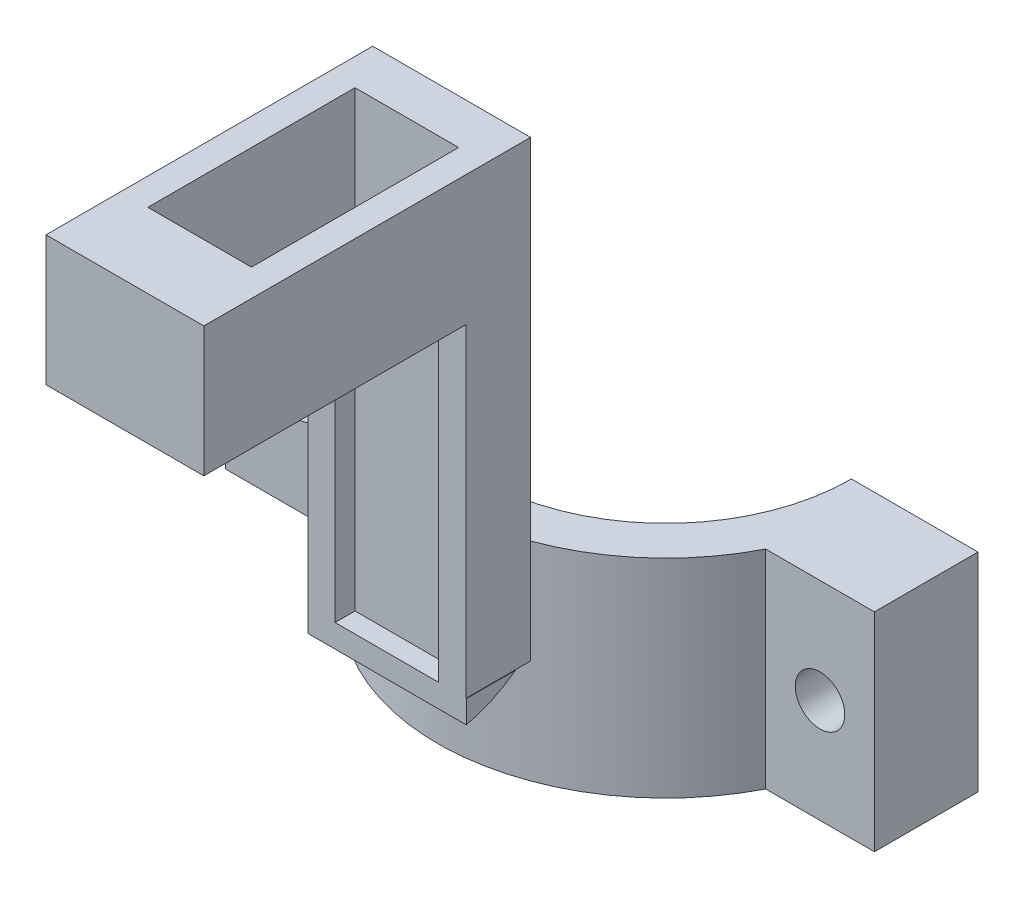
ISO-10303-21;
HEADER;
FILE_DESCRIPTION(('STEP AP214'),'2;1');
FILE_NAME('part.step','',(''),(''),'','','');
FILE_SCHEMA(('AUTOMOTIVE_DESIGN { 1 0 10303 214 1 1 1 1 }'));
ENDSEC;
DATA;
#1=APPLICATION_CONTEXT('core data for automotive mechanical design processes');
#2=APPLICATION_PROTOCOL_DEFINITION('international standard','automotive_design',2000,#1);
#3=PRODUCT_CONTEXT('',#1,'mechanical');
#4=PRODUCT('Part','Part','',(#3));
#5=PRODUCT_RELATED_PRODUCT_CATEGORY('part','',(#4));
#6=PRODUCT_DEFINITION_FORMATION('','',#4);
#7=PRODUCT_DEFINITION_CONTEXT('part definition',#1,'design');
#8=PRODUCT_DEFINITION('design','',#6,#7);
#9=PRODUCT_DEFINITION_SHAPE('','',#8);
#10=(LENGTH_UNIT() NAMED_UNIT(*) SI_UNIT(.MILLI.,.METRE.));
#11=(NAMED_UNIT(*) PLANE_ANGLE_UNIT() SI_UNIT($,.RADIAN.));
#12=(NAMED_UNIT(*) SI_UNIT($,.STERADIAN.) SOLID_ANGLE_UNIT());
#13=UNCERTAINTY_MEASURE_WITH_UNIT(LENGTH_MEASURE(1.E-05),#10,'distance_accuracy_value','');
#14=(GEOMETRIC_REPRESENTATION_CONTEXT(3) GLOBAL_UNCERTAINTY_ASSIGNED_CONTEXT((#13)) GLOBAL_UNIT_ASSIGNED_CONTEXT((#10,
#11,#12)) REPRESENTATION_CONTEXT('',''));
#15=CARTESIAN_POINT('',(0.,0.,0.));
#16=DIRECTION('',(0.,0.,1.));
#17=DIRECTION('',(1.,0.,0.));
#18=AXIS2_PLACEMENT_3D('',#15,#16,#17);
#19=CARTESIAN_POINT('',(-4.,61.28,36.0000000000001));
#20=DIRECTION('',(0.,0.,-1.));
#21=DIRECTION('',(-1.,0.,0.));
#22=AXIS2_PLACEMENT_3D('',#19,#20,#21);
#23=PLANE('',#22);
#24=DIRECTION('',(0.,-1.,0.));
#25=VECTOR('',#24,1.);
#26=CARTESIAN_POINT('',(4.,61.28,36.0000000000001));
#27=LINE('',#26,#25);
#28=CARTESIAN_POINT('',(4.,43.05,36.0000000000001));
#29=VERTEX_POINT('',#28);
#30=CARTESIAN_POINT('',(4.,35.05,36.0000000000001));
#31=VERTEX_POINT('',#30);
#32=EDGE_CURVE('E225',#29,#31,#27,.T.);
#33=ORIENTED_EDGE('',*,*,#32,.T.);
#34=DIRECTION('',(1.,0.,0.));
#35=VECTOR('',#34,1.);
#36=CARTESIAN_POINT('',(4.,35.05,36.0000000000001));
#37=LINE('',#36,#35);
#38=CARTESIAN_POINT('',(-4.,35.05,36.0000000000001));
#39=VERTEX_POINT('',#38);
#40=EDGE_CURVE('E211',#39,#31,#37,.T.);
#41=ORIENTED_EDGE('',*,*,#40,.F.);
#42=DIRECTION('',(0.,-1.,0.));
#43=VECTOR('',#42,1.);
#44=CARTESIAN_POINT('',(-4.,61.28,36.0000000000001));
#45=LINE('',#44,#43);
#46=CARTESIAN_POINT('',(-4.,43.05,36.0000000000001));
#47=VERTEX_POINT('',#46);
#48=EDGE_CURVE('E222',#47,#39,#45,.T.);
#49=ORIENTED_EDGE('',*,*,#48,.F.);
#50=DIRECTION('',(-1.,0.,0.));
#51=VECTOR('',#50,1.);
#52=CARTESIAN_POINT('',(0.,43.05,36.0000000000001));
#53=LINE('',#52,#51);
#54=EDGE_CURVE('E244',#29,#47,#53,.T.);
#55=ORIENTED_EDGE('',*,*,#54,.F.);
#56=EDGE_LOOP('',(#33,#41,#49,#55));
#57=FACE_BOUND('',#56,.T.);
#58=ADVANCED_FACE('F40',(#57),#23,.T.);
#59=CARTESIAN_POINT('',(4.,61.28,20.0000000000001));
#60=DIRECTION('',(-1.,0.,0.));
#61=DIRECTION('',(0.,0.,1.));
#62=AXIS2_PLACEMENT_3D('',#59,#60,#61);
#63=PLANE('',#62);
#64=DIRECTION('',(0.,1.,0.));
#65=VECTOR('',#64,1.);
#66=CARTESIAN_POINT('',(4.,43.05,21.5429101127945));
#67=LINE('',#66,#65);
#68=CARTESIAN_POINT('',(4.,8.05,21.5429101127945));
#69=VERTEX_POINT('',#68);
#70=CARTESIAN_POINT('',(4.,33.02,21.5429101127945));
#71=VERTEX_POINT('',#70);
#72=EDGE_CURVE('E249',#69,#71,#67,.T.);
#73=ORIENTED_EDGE('',*,*,#72,.T.);
#74=DIRECTION('',(0.,0.,1.));
#75=VECTOR('',#74,1.);
#76=CARTESIAN_POINT('',(4.,33.02,19.7700000000001));
#77=LINE('',#76,#75);
#78=CARTESIAN_POINT('',(4.,33.02,20.0000000000001));
#79=VERTEX_POINT('',#78);
#80=EDGE_CURVE('E55',#79,#71,#77,.T.);
#81=ORIENTED_EDGE('',*,*,#80,.F.);
#82=DIRECTION('',(0.,-1.,0.));
#83=VECTOR('',#82,1.);
#84=CARTESIAN_POINT('',(4.,61.28,20.0000000000001));
#85=LINE('',#84,#83);
#86=CARTESIAN_POINT('',(4.,8.05,20.0000000000001));
#87=VERTEX_POINT('',#86);
#88=EDGE_CURVE('E240',#79,#87,#85,.T.);
#89=ORIENTED_EDGE('',*,*,#88,.T.);
#90=DIRECTION('',(0.,0.,-1.));
#91=VECTOR('',#90,1.);
#92=CARTESIAN_POINT('',(4.,8.05,20.0000000000001));
#93=LINE('',#92,#91);
#94=EDGE_CURVE('E412',#69,#87,#93,.T.);
#95=ORIENTED_EDGE('',*,*,#94,.F.);
#96=EDGE_LOOP('',(#73,#81,#89,#95));
#97=FACE_BOUND('',#96,.T.);
#98=ADVANCED_FACE('F448',(#97),#63,.T.);
#99=CARTESIAN_POINT('',(4.,43.05,20.0000000000001));
#100=VERTEX_POINT('',#99);
#101=CARTESIAN_POINT('',(4.,35.05,20.0000000000001));
#102=VERTEX_POINT('',#101);
#103=EDGE_CURVE('E241',#100,#102,#85,.T.);
#104=ORIENTED_EDGE('',*,*,#103,.T.);
#105=DIRECTION('',(0.,0.,1.));
#106=VECTOR('',#105,1.);
#107=CARTESIAN_POINT('',(4.,35.05,19.7700000000001));
#108=LINE('',#107,#106);
#109=EDGE_CURVE('E226',#102,#31,#108,.T.);
#110=ORIENTED_EDGE('',*,*,#109,.T.);
#111=ORIENTED_EDGE('',*,*,#32,.F.);
#112=DIRECTION('',(0.,0.,1.));
#113=VECTOR('',#112,1.);
#114=CARTESIAN_POINT('',(4.,43.05,0.));
#115=LINE('',#114,#113);
#116=EDGE_CURVE('E251',#100,#29,#115,.T.);
#117=ORIENTED_EDGE('',*,*,#116,.F.);
#118=EDGE_LOOP('',(#104,#110,#111,#117));
#119=FACE_BOUND('',#118,.T.);
#120=ADVANCED_FACE('F428',(#119),#63,.T.);
#121=CARTESIAN_POINT('',(-4.,61.28,20.0000000000001));
#122=DIRECTION('',(0.,0.,1.));
#123=DIRECTION('',(1.,0.,0.));
#124=AXIS2_PLACEMENT_3D('',#121,#122,#123);
#125=PLANE('',#124);
#126=ORIENTED_EDGE('',*,*,#88,.F.);
#127=DIRECTION('',(-1.,0.,0.));
#128=VECTOR('',#127,1.);
#129=CARTESIAN_POINT('',(-4.,33.02,20.0000000000001));
#130=LINE('',#129,#128);
#131=CARTESIAN_POINT('',(-4.,33.02,20.0000000000001));
#132=VERTEX_POINT('',#131);
#133=EDGE_CURVE('E62',#79,#132,#130,.T.);
#134=ORIENTED_EDGE('',*,*,#133,.T.);
#135=DIRECTION('',(0.,-1.,0.));
#136=VECTOR('',#135,1.);
#137=CARTESIAN_POINT('',(-4.,61.28,20.0000000000001));
#138=LINE('',#137,#136);
#139=CARTESIAN_POINT('',(-4.,8.05,20.0000000000001));
#140=VERTEX_POINT('',#139);
#141=EDGE_CURVE('E232',#132,#140,#138,.T.);
#142=ORIENTED_EDGE('',*,*,#141,.T.);
#143=DIRECTION('',(-1.,0.,0.));
#144=VECTOR('',#143,1.);
#145=CARTESIAN_POINT('',(-4.,8.05,20.0000000000001));
#146=LINE('',#145,#144);
#147=EDGE_CURVE('E410',#87,#140,#146,.T.);
#148=ORIENTED_EDGE('',*,*,#147,.F.);
#149=EDGE_LOOP('',(#126,#134,#142,#148));
#150=FACE_BOUND('',#149,.T.);
#151=ADVANCED_FACE('F460',(#150),#125,.T.);
#152=CARTESIAN_POINT('',(-4.,43.05,20.0000000000001));
#153=VERTEX_POINT('',#152);
#154=CARTESIAN_POINT('',(-4.,35.05,20.0000000000001));
#155=VERTEX_POINT('',#154);
#156=EDGE_CURVE('E234',#153,#155,#138,.T.);
#157=ORIENTED_EDGE('',*,*,#156,.T.);
#158=DIRECTION('',(1.,0.,0.));
#159=VECTOR('',#158,1.);
#160=CARTESIAN_POINT('',(-4.,35.05,20.0000000000001));
#161=LINE('',#160,#159);
#162=EDGE_CURVE('E214',#155,#102,#161,.T.);
#163=ORIENTED_EDGE('',*,*,#162,.T.);
#164=ORIENTED_EDGE('',*,*,#103,.F.);
#165=DIRECTION('',(1.,0.,0.));
#166=VECTOR('',#165,1.);
#167=CARTESIAN_POINT('',(0.,43.05,20.0000000000001));
#168=LINE('',#167,#166);
#169=EDGE_CURVE('E392',#153,#100,#168,.T.);
#170=ORIENTED_EDGE('',*,*,#169,.F.);
#171=EDGE_LOOP('',(#157,#163,#164,#170));
#172=FACE_BOUND('',#171,.T.);
#173=ADVANCED_FACE('F431',(#172),#125,.T.);
#174=CARTESIAN_POINT('',(-4.,61.28,20.0000000000001));
#175=DIRECTION('',(1.,0.,0.));
#176=DIRECTION('',(0.,0.,-1.));
#177=AXIS2_PLACEMENT_3D('',#174,#175,#176);
#178=PLANE('',#177);
#179=ORIENTED_EDGE('',*,*,#141,.F.);
#180=DIRECTION('',(0.,0.,1.));
#181=VECTOR('',#180,1.);
#182=CARTESIAN_POINT('',(-4.,33.02,20.0000000000001));
#183=LINE('',#182,#181);
#184=CARTESIAN_POINT('',(-4.,33.02,21.5429101127945));
#185=VERTEX_POINT('',#184);
#186=EDGE_CURVE('E12',#132,#185,#183,.T.);
#187=ORIENTED_EDGE('',*,*,#186,.T.);
#188=DIRECTION('',(0.,-1.,0.));
#189=VECTOR('',#188,1.);
#190=CARTESIAN_POINT('',(-4.,43.05,21.5429101127945));
#191=LINE('',#190,#189);
#192=CARTESIAN_POINT('',(-4.,8.05,21.5429101127945));
#193=VERTEX_POINT('',#192);
#194=EDGE_CURVE('E246',#185,#193,#191,.T.);
#195=ORIENTED_EDGE('',*,*,#194,.T.);
#196=DIRECTION('',(0.,0.,1.));
#197=VECTOR('',#196,1.);
#198=CARTESIAN_POINT('',(-4.,8.05,20.0000000000001));
#199=LINE('',#198,#197);
#200=EDGE_CURVE('E236',#140,#193,#199,.T.);
#201=ORIENTED_EDGE('',*,*,#200,.F.);
#202=EDGE_LOOP('',(#179,#187,#195,#201));
#203=FACE_BOUND('',#202,.T.);
#204=ADVANCED_FACE('F457',(#203),#178,.T.);
#205=ORIENTED_EDGE('',*,*,#48,.T.);
#206=DIRECTION('',(0.,0.,-1.));
#207=VECTOR('',#206,1.);
#208=CARTESIAN_POINT('',(-4.,35.05,20.0000000000001));
#209=LINE('',#208,#207);
#210=EDGE_CURVE('E48',#39,#155,#209,.T.);
#211=ORIENTED_EDGE('',*,*,#210,.T.);
#212=ORIENTED_EDGE('',*,*,#156,.F.);
#213=DIRECTION('',(0.,0.,-1.));
#214=VECTOR('',#213,1.);
#215=CARTESIAN_POINT('',(-4.00000000000001,43.05,0.));
#216=LINE('',#215,#214);
#217=EDGE_CURVE('E230',#47,#153,#216,.T.);
#218=ORIENTED_EDGE('',*,*,#217,.F.);
#219=EDGE_LOOP('',(#205,#211,#212,#218));
#220=FACE_BOUND('',#219,.T.);
#221=ADVANCED_FACE('F228',(#220),#178,.T.);
#222=CARTESIAN_POINT('',(-6.095,43.05,21.5429101127945));
#223=DIRECTION('',(0.,0.,-1.));
#224=DIRECTION('',(-1.,0.,0.));
#225=AXIS2_PLACEMENT_3D('',#222,#223,#224);
#226=PLANE('',#225);
#227=ORIENTED_EDGE('',*,*,#194,.F.);
#228=DIRECTION('',(1.,0.,0.));
#229=VECTOR('',#228,1.);
#230=CARTESIAN_POINT('',(-6.095,33.02,21.5429101127945));
#231=LINE('',#230,#229);
#232=CARTESIAN_POINT('',(-6.095,33.02,21.5429101127945));
#233=VERTEX_POINT('',#232);
#234=EDGE_CURVE('E259',#233,#185,#231,.T.);
#235=ORIENTED_EDGE('',*,*,#234,.F.);
#236=DIRECTION('',(0.,-1.,0.));
#237=VECTOR('',#236,1.);
#238=CARTESIAN_POINT('',(-6.095,43.05,21.5429101127945));
#239=LINE('',#238,#237);
#240=CARTESIAN_POINT('',(-6.095,6.27160293898606,21.5429101127945));
#241=VERTEX_POINT('',#240);
#242=EDGE_CURVE('E290',#233,#241,#239,.T.);
#243=ORIENTED_EDGE('',*,*,#242,.T.);
#244=DIRECTION('',(1.,0.,0.));
#245=VECTOR('',#244,1.);
#246=CARTESIAN_POINT('',(-6.095,6.27160293898606,21.5429101127945));
#247=LINE('',#246,#245);
#248=CARTESIAN_POINT('',(6.13145783911052,6.27160293898606,21.5429101127945));
#249=VERTEX_POINT('',#248);
#250=EDGE_CURVE('E422',#241,#249,#247,.T.);
#251=ORIENTED_EDGE('',*,*,#250,.T.);
#252=DIRECTION('',(0.,-1.,0.));
#253=VECTOR('',#252,1.);
#254=CARTESIAN_POINT('',(6.13145783911052,6.025,21.5429101127945));
#255=LINE('',#254,#253);
#256=CARTESIAN_POINT('',(6.13145783911052,8.025,21.5429101127945));
#257=VERTEX_POINT('',#256);
#258=EDGE_CURVE('E419',#257,#249,#255,.T.);
#259=ORIENTED_EDGE('',*,*,#258,.F.);
#260=DIRECTION('',(1.,0.,0.));
#261=VECTOR('',#260,1.);
#262=CARTESIAN_POINT('',(0.,8.025,21.5429101127945));
#263=LINE('',#262,#261);
#264=CARTESIAN_POINT('',(6.095,8.025,21.5429101127945));
#265=VERTEX_POINT('',#264);
#266=EDGE_CURVE('E416',#265,#257,#263,.T.);
#267=ORIENTED_EDGE('',*,*,#266,.F.);
#268=DIRECTION('',(0.,-1.,0.));
#269=VECTOR('',#268,1.);
#270=CARTESIAN_POINT('',(6.095,43.05,21.5429101127945));
#271=LINE('',#270,#269);
#272=CARTESIAN_POINT('',(6.095,33.02,21.5429101127945));
#273=VERTEX_POINT('',#272);
#274=EDGE_CURVE('E288',#273,#265,#271,.T.);
#275=ORIENTED_EDGE('',*,*,#274,.F.);
#276=EDGE_CURVE('E254',#71,#273,#231,.T.);
#277=ORIENTED_EDGE('',*,*,#276,.F.);
#278=ORIENTED_EDGE('',*,*,#72,.F.);
#279=DIRECTION('',(-1.,0.,0.));
#280=VECTOR('',#279,1.);
#281=CARTESIAN_POINT('',(0.,8.05,21.5429101127945));
#282=LINE('',#281,#280);
#283=EDGE_CURVE('E219',#69,#193,#282,.T.);
#284=ORIENTED_EDGE('',*,*,#283,.T.);
#285=EDGE_LOOP('',(#227,#235,#243,#251,#259,#267,#275,#277,#278,#284));
#286=FACE_BOUND('',#285,.T.);
#287=ADVANCED_FACE('F400',(#286),#226,.F.);
#288=CARTESIAN_POINT('',(0.,43.05,0.));
#289=DIRECTION('',(0.,1.,0.));
#290=DIRECTION('',(0.,0.,1.));
#291=AXIS2_PLACEMENT_3D('',#288,#289,#290);
#292=PLANE('',#291);
#293=DIRECTION('',(0.,0.,1.));
#294=VECTOR('',#293,1.);
#295=CARTESIAN_POINT('',(-6.095,43.05,16.5429101127945));
#296=LINE('',#295,#294);
#297=CARTESIAN_POINT('',(-6.095,43.05,16.5429101127945));
#298=VERTEX_POINT('',#297);
#299=CARTESIAN_POINT('',(-6.095,43.05,41.7729101127945));
#300=VERTEX_POINT('',#299);
#301=EDGE_CURVE('E274',#298,#300,#296,.T.);
#302=ORIENTED_EDGE('',*,*,#301,.T.);
#303=DIRECTION('',(-1.,0.,0.));
#304=VECTOR('',#303,1.);
#305=CARTESIAN_POINT('',(-6.095,43.05,41.7729101127945));
#306=LINE('',#305,#304);
#307=CARTESIAN_POINT('',(6.095,43.05,41.7729101127945));
#308=VERTEX_POINT('',#307);
#309=EDGE_CURVE('E264',#308,#300,#306,.T.);
#310=ORIENTED_EDGE('',*,*,#309,.F.);
#311=DIRECTION('',(0.,0.,-1.));
#312=VECTOR('',#311,1.);
#313=CARTESIAN_POINT('',(6.095,43.05,16.5429101127945));
#314=LINE('',#313,#312);
#315=CARTESIAN_POINT('',(6.095,43.05,16.5429101127945));
#316=VERTEX_POINT('',#315);
#317=EDGE_CURVE('E276',#308,#316,#314,.T.);
#318=ORIENTED_EDGE('',*,*,#317,.T.);
#319=DIRECTION('',(-1.,0.,0.));
#320=VECTOR('',#319,1.);
#321=CARTESIAN_POINT('',(-6.095,43.05,16.5429101127945));
#322=LINE('',#321,#320);
#323=EDGE_CURVE('E278',#316,#298,#322,.T.);
#324=ORIENTED_EDGE('',*,*,#323,.T.);
#325=EDGE_LOOP('',(#302,#310,#318,#324));
#326=FACE_BOUND('',#325,.T.);
#327=ORIENTED_EDGE('',*,*,#169,.T.);
#328=ORIENTED_EDGE('',*,*,#116,.T.);
#329=ORIENTED_EDGE('',*,*,#54,.T.);
#330=ORIENTED_EDGE('',*,*,#217,.T.);
#331=EDGE_LOOP('',(#327,#328,#329,#330));
#332=FACE_BOUND('',#331,.T.);
#333=ADVANCED_FACE('F433',(#326,#332),#292,.T.);
#334=CARTESIAN_POINT('',(-6.095,33.02,41.7729101127945));
#335=DIRECTION('',(0.,1.,0.));
#336=DIRECTION('',(0.,0.,1.));
#337=AXIS2_PLACEMENT_3D('',#334,#335,#336);
#338=PLANE('',#337);
#339=ORIENTED_EDGE('',*,*,#80,.T.);
#340=ORIENTED_EDGE('',*,*,#276,.T.);
#341=DIRECTION('',(0.,0.,-1.));
#342=VECTOR('',#341,1.);
#343=CARTESIAN_POINT('',(6.095,33.02,41.7729101127945));
#344=LINE('',#343,#342);
#345=CARTESIAN_POINT('',(6.095,33.02,41.7729101127945));
#346=VERTEX_POINT('',#345);
#347=EDGE_CURVE('E267',#346,#273,#344,.T.);
#348=ORIENTED_EDGE('',*,*,#347,.F.);
#349=DIRECTION('',(1.,0.,0.));
#350=VECTOR('',#349,1.);
#351=CARTESIAN_POINT('',(-6.095,33.02,41.7729101127945));
#352=LINE('',#351,#350);
#353=CARTESIAN_POINT('',(-6.095,33.02,41.7729101127945));
#354=VERTEX_POINT('',#353);
#355=EDGE_CURVE('E258',#354,#346,#352,.T.);
#356=ORIENTED_EDGE('',*,*,#355,.F.);
#357=DIRECTION('',(0.,0.,-1.));
#358=VECTOR('',#357,1.);
#359=CARTESIAN_POINT('',(-6.095,33.02,41.7729101127945));
#360=LINE('',#359,#358);
#361=EDGE_CURVE('E271',#354,#233,#360,.T.);
#362=ORIENTED_EDGE('',*,*,#361,.T.);
#363=ORIENTED_EDGE('',*,*,#234,.T.);
#364=ORIENTED_EDGE('',*,*,#186,.F.);
#365=ORIENTED_EDGE('',*,*,#133,.F.);
#366=EDGE_LOOP('',(#339,#340,#348,#356,#362,#363,#364,#365));
#367=FACE_BOUND('',#366,.T.);
#368=ADVANCED_FACE('F435',(#367),#338,.F.);
#369=CARTESIAN_POINT('',(0.,16.05,0.));
#370=DIRECTION('',(0.,1.,0.));
#371=DIRECTION('',(0.,0.,1.));
#372=AXIS2_PLACEMENT_3D('',#369,#370,#371);
#373=PLANE('',#372);
#374=DIRECTION('',(-1.,0.,0.));
#375=VECTOR('',#374,1.);
#376=CARTESIAN_POINT('',(-6.095,16.05,16.5429101127945));
#377=LINE('',#376,#375);
#378=CARTESIAN_POINT('',(6.095,16.05,16.5429101127945));
#379=VERTEX_POINT('',#378);
#380=CARTESIAN_POINT('',(-6.095,16.05,16.5429101127945));
#381=VERTEX_POINT('',#380);
#382=EDGE_CURVE('E273',#379,#381,#377,.T.);
#383=ORIENTED_EDGE('',*,*,#382,.F.);
#384=CARTESIAN_POINT('',(0.,16.05,0.));
#385=DIRECTION('',(0.,1.,0.));
#386=DIRECTION('',(1.,0.,0.));
#387=AXIS2_PLACEMENT_3D('',#384,#385,#386);
#388=CIRCLE('',#387,17.63);
#389=CARTESIAN_POINT('',(15.7104073785501,16.05,8.));
#390=VERTEX_POINT('',#389);
#391=EDGE_CURVE('E369',#379,#390,#388,.T.);
#392=ORIENTED_EDGE('',*,*,#391,.T.);
#393=DIRECTION('',(1.,0.,0.));
#394=VECTOR('',#393,1.);
#395=CARTESIAN_POINT('',(14.75,16.05,8.));
#396=LINE('',#395,#394);
#397=CARTESIAN_POINT('',(24.11,16.05,8.));
#398=VERTEX_POINT('',#397);
#399=EDGE_CURVE('E353',#390,#398,#396,.T.);
#400=ORIENTED_EDGE('',*,*,#399,.T.);
#401=DIRECTION('',(0.,0.,1.));
#402=VECTOR('',#401,1.);
#403=CARTESIAN_POINT('',(24.11,16.05,-8.));
#404=LINE('',#403,#402);
#405=CARTESIAN_POINT('',(24.11,16.05,0.));
#406=VERTEX_POINT('',#405);
#407=EDGE_CURVE('E346',#406,#398,#404,.T.);
#408=ORIENTED_EDGE('',*,*,#407,.F.);
#409=DIRECTION('',(1.,0.,0.));
#410=VECTOR('',#409,1.);
#411=CARTESIAN_POINT('',(24.11,16.05,0.));
#412=LINE('',#411,#410);
#413=CARTESIAN_POINT('',(14.34,16.05,0.));
#414=VERTEX_POINT('',#413);
#415=EDGE_CURVE('E301',#414,#406,#412,.T.);
#416=ORIENTED_EDGE('',*,*,#415,.F.);
#417=CARTESIAN_POINT('',(0.,16.05,0.));
#418=DIRECTION('',(0.,1.,0.));
#419=DIRECTION('',(0.,0.,1.));
#420=AXIS2_PLACEMENT_3D('',#417,#418,#419);
#421=CIRCLE('',#420,14.34);
#422=CARTESIAN_POINT('',(-14.34,16.05,0.));
#423=VERTEX_POINT('',#422);
#424=EDGE_CURVE('E360',#423,#414,#421,.T.);
#425=ORIENTED_EDGE('',*,*,#424,.F.);
#426=CARTESIAN_POINT('',(-26.54,16.05,0.));
#427=VERTEX_POINT('',#426);
#428=EDGE_CURVE('E306',#427,#423,#412,.T.);
#429=ORIENTED_EDGE('',*,*,#428,.F.);
#430=DIRECTION('',(0.,0.,-1.));
#431=VECTOR('',#430,1.);
#432=CARTESIAN_POINT('',(-26.54,16.05,-8.54354494360273));
#433=LINE('',#432,#431);
#434=CARTESIAN_POINT('',(-26.54,16.05,7.45645505639727));
#435=VERTEX_POINT('',#434);
#436=EDGE_CURVE('E325',#435,#427,#433,.T.);
#437=ORIENTED_EDGE('',*,*,#436,.F.);
#438=DIRECTION('',(1.,0.,0.));
#439=VECTOR('',#438,1.);
#440=CARTESIAN_POINT('',(-27.75,16.05,7.45645505639727));
#441=LINE('',#440,#439);
#442=CARTESIAN_POINT('',(-15.9755493799721,16.05,7.45645505639727));
#443=VERTEX_POINT('',#442);
#444=EDGE_CURVE('E334',#435,#443,#441,.T.);
#445=ORIENTED_EDGE('',*,*,#444,.T.);
#446=EDGE_CURVE('E366',#443,#381,#388,.T.);
#447=ORIENTED_EDGE('',*,*,#446,.T.);
#448=EDGE_LOOP('',(#383,#392,#400,#408,#416,#425,#429,#437,#445,#447));
#449=FACE_BOUND('',#448,.T.);
#450=ADVANCED_FACE('F442',(#449),#373,.T.);
#451=CARTESIAN_POINT('',(-6.095,8.025,14.98));
#452=DIRECTION('',(0.,-1.,0.));
#453=DIRECTION('',(0.,0.,-1.));
#454=AXIS2_PLACEMENT_3D('',#451,#452,#453);
#455=PLANE('',#454);
#456=DIRECTION('',(0.,0.,1.));
#457=VECTOR('',#456,1.);
#458=CARTESIAN_POINT('',(6.095,8.025,14.98));
#459=LINE('',#458,#457);
#460=CARTESIAN_POINT('',(6.095,8.025,16.5429101127945));
#461=VERTEX_POINT('',#460);
#462=CARTESIAN_POINT('',(6.095,8.025,17.75));
#463=VERTEX_POINT('',#462);
#464=EDGE_CURVE('E338',#461,#463,#459,.T.);
#465=ORIENTED_EDGE('',*,*,#464,.T.);
#466=DIRECTION('',(1.,0.,0.));
#467=VECTOR('',#466,1.);
#468=CARTESIAN_POINT('',(-6.095,8.025,17.75));
#469=LINE('',#468,#467);
#470=CARTESIAN_POINT('',(-6.095,8.025,17.75));
#471=VERTEX_POINT('',#470);
#472=EDGE_CURVE('E293',#471,#463,#469,.T.);
#473=ORIENTED_EDGE('',*,*,#472,.F.);
#474=DIRECTION('',(0.,0.,1.));
#475=VECTOR('',#474,1.);
#476=CARTESIAN_POINT('',(-6.095,8.025,14.98));
#477=LINE('',#476,#475);
#478=CARTESIAN_POINT('',(-6.095,8.025,16.5429101127945));
#479=VERTEX_POINT('',#478);
#480=EDGE_CURVE('E336',#479,#471,#477,.T.);
#481=ORIENTED_EDGE('',*,*,#480,.F.);
#482=CARTESIAN_POINT('',(0.,8.025,0.));
#483=DIRECTION('',(0.,-1.,0.));
#484=DIRECTION('',(0.,0.,-1.));
#485=AXIS2_PLACEMENT_3D('',#482,#483,#484);
#486=CIRCLE('',#485,17.63);
#487=EDGE_CURVE('E376',#461,#479,#486,.T.);
#488=ORIENTED_EDGE('',*,*,#487,.F.);
#489=EDGE_LOOP('',(#465,#473,#481,#488));
#490=FACE_BOUND('',#489,.T.);
#491=ADVANCED_FACE('F488',(#490),#455,.T.);
#492=CARTESIAN_POINT('',(0.,16.05,0.));
#493=DIRECTION('',(0.,-1.,0.));
#494=DIRECTION('',(0.,0.,-1.));
#495=AXIS2_PLACEMENT_3D('',#492,#493,#494);
#496=CYLINDRICAL_SURFACE('',#495,17.63);
#497=ORIENTED_EDGE('',*,*,#446,.F.);
#498=DIRECTION('',(0.,-1.,0.));
#499=VECTOR('',#498,1.);
#500=CARTESIAN_POINT('',(-15.9755493799721,16.05,7.45645505639727));
#501=LINE('',#500,#499);
#502=CARTESIAN_POINT('',(-15.9755493799721,0.,7.45645505639727));
#503=VERTEX_POINT('',#502);
#504=EDGE_CURVE('E382',#443,#503,#501,.T.);
#505=ORIENTED_EDGE('',*,*,#504,.T.);
#506=CARTESIAN_POINT('',(0.,0.,0.));
#507=DIRECTION('',(0.,1.,0.));
#508=DIRECTION('',(1.,0.,0.));
#509=AXIS2_PLACEMENT_3D('',#506,#507,#508);
#510=CIRCLE('',#509,17.63);
#511=CARTESIAN_POINT('',(15.7104073785501,0.,8.));
#512=VERTEX_POINT('',#511);
#513=EDGE_CURVE('E363',#503,#512,#510,.T.);
#514=ORIENTED_EDGE('',*,*,#513,.T.);
#515=DIRECTION('',(0.,-1.,0.));
#516=VECTOR('',#515,1.);
#517=CARTESIAN_POINT('',(15.7104073785501,16.05,8.));
#518=LINE('',#517,#516);
#519=EDGE_CURVE('E368',#512,#390,#518,.F.);
#520=ORIENTED_EDGE('',*,*,#519,.T.);
#521=ORIENTED_EDGE('',*,*,#391,.F.);
#522=DIRECTION('',(0.,-1.,0.));
#523=VECTOR('',#522,1.);
#524=CARTESIAN_POINT('',(6.095,16.05,16.5429101127945));
#525=LINE('',#524,#523);
#526=EDGE_CURVE('E379',#379,#461,#525,.T.);
#527=ORIENTED_EDGE('',*,*,#526,.T.);
#528=ORIENTED_EDGE('',*,*,#487,.T.);
#529=DIRECTION('',(0.,-1.,0.));
#530=VECTOR('',#529,1.);
#531=CARTESIAN_POINT('',(-6.095,16.05,16.5429101127945));
#532=LINE('',#531,#530);
#533=EDGE_CURVE('E373',#479,#381,#532,.F.);
#534=ORIENTED_EDGE('',*,*,#533,.T.);
#535=EDGE_LOOP('',(#497,#505,#514,#520,#521,#527,#528,#534));
#536=FACE_BOUND('',#535,.T.);
#537=ADVANCED_FACE('F492',(#536),#496,.T.);
#538=CARTESIAN_POINT('',(0.,0.,0.));
#539=DIRECTION('',(0.,1.,0.));
#540=DIRECTION('',(0.,0.,1.));
#541=AXIS2_PLACEMENT_3D('',#538,#539,#540);
#542=PLANE('',#541);
#543=DIRECTION('',(0.,0.,-1.));
#544=VECTOR('',#543,1.);
#545=CARTESIAN_POINT('',(-26.54,0.,-8.54354494360273));
#546=LINE('',#545,#544);
#547=CARTESIAN_POINT('',(-26.54,0.,7.45645505639727));
#548=VERTEX_POINT('',#547);
#549=CARTESIAN_POINT('',(-26.54,0.,0.));
#550=VERTEX_POINT('',#549);
#551=EDGE_CURVE('E326',#548,#550,#546,.T.);
#552=ORIENTED_EDGE('',*,*,#551,.T.);
#553=DIRECTION('',(1.,0.,0.));
#554=VECTOR('',#553,1.);
#555=CARTESIAN_POINT('',(24.11,0.,0.));
#556=LINE('',#555,#554);
#557=CARTESIAN_POINT('',(-14.34,0.,0.));
#558=VERTEX_POINT('',#557);
#559=EDGE_CURVE('E305',#550,#558,#556,.T.);
#560=ORIENTED_EDGE('',*,*,#559,.T.);
#561=CARTESIAN_POINT('',(0.,0.,0.));
#562=DIRECTION('',(0.,1.,0.));
#563=DIRECTION('',(0.,0.,1.));
#564=AXIS2_PLACEMENT_3D('',#561,#562,#563);
#565=CIRCLE('',#564,14.34);
#566=CARTESIAN_POINT('',(14.34,0.,0.));
#567=VERTEX_POINT('',#566);
#568=EDGE_CURVE('E357',#558,#567,#565,.T.);
#569=ORIENTED_EDGE('',*,*,#568,.T.);
#570=CARTESIAN_POINT('',(24.11,0.,0.));
#571=VERTEX_POINT('',#570);
#572=EDGE_CURVE('E302',#567,#571,#556,.T.);
#573=ORIENTED_EDGE('',*,*,#572,.T.);
#574=DIRECTION('',(0.,0.,1.));
#575=VECTOR('',#574,1.);
#576=CARTESIAN_POINT('',(24.11,0.,-8.));
#577=LINE('',#576,#575);
#578=CARTESIAN_POINT('',(24.11,0.,8.));
#579=VERTEX_POINT('',#578);
#580=EDGE_CURVE('E347',#571,#579,#577,.T.);
#581=ORIENTED_EDGE('',*,*,#580,.T.);
#582=DIRECTION('',(1.,0.,0.));
#583=VECTOR('',#582,1.);
#584=CARTESIAN_POINT('',(14.75,0.,8.));
#585=LINE('',#584,#583);
#586=EDGE_CURVE('E354',#512,#579,#585,.T.);
#587=ORIENTED_EDGE('',*,*,#586,.F.);
#588=ORIENTED_EDGE('',*,*,#513,.F.);
#589=DIRECTION('',(1.,0.,0.));
#590=VECTOR('',#589,1.);
#591=CARTESIAN_POINT('',(-27.75,0.,7.45645505639727));
#592=LINE('',#591,#590);
#593=EDGE_CURVE('E333',#548,#503,#592,.T.);
#594=ORIENTED_EDGE('',*,*,#593,.F.);
#595=EDGE_LOOP('',(#552,#560,#569,#573,#581,#587,#588,#594));
#596=FACE_BOUND('',#595,.T.);
#597=ADVANCED_FACE('F522',(#596),#542,.F.);
#598=CARTESIAN_POINT('',(0.,16.05,0.));
#599=DIRECTION('',(0.,-1.,0.));
#600=DIRECTION('',(0.,0.,-1.));
#601=AXIS2_PLACEMENT_3D('',#598,#599,#600);
#602=CYLINDRICAL_SURFACE('',#601,14.34);
#603=DIRECTION('',(0.,-1.,0.));
#604=VECTOR('',#603,1.);
#605=CARTESIAN_POINT('',(-14.34,16.05,0.));
#606=LINE('',#605,#604);
#607=EDGE_CURVE('E320',#423,#558,#606,.T.);
#608=ORIENTED_EDGE('',*,*,#607,.F.);
#609=ORIENTED_EDGE('',*,*,#424,.T.);
#610=DIRECTION('',(0.,-1.,0.));
#611=VECTOR('',#610,1.);
#612=CARTESIAN_POINT('',(14.34,16.05,0.));
#613=LINE('',#612,#611);
#614=EDGE_CURVE('E318',#567,#414,#613,.F.);
#615=ORIENTED_EDGE('',*,*,#614,.F.);
#616=ORIENTED_EDGE('',*,*,#568,.F.);
#617=EDGE_LOOP('',(#608,#609,#615,#616));
#618=FACE_BOUND('',#617,.T.);
#619=ADVANCED_FACE('F541',(#618),#602,.F.);
#620=CARTESIAN_POINT('',(14.75,16.05,8.));
#621=DIRECTION('',(0.,0.,1.));
#622=DIRECTION('',(1.,0.,0.));
#623=AXIS2_PLACEMENT_3D('',#620,#621,#622);
#624=PLANE('',#623);
#625=CARTESIAN_POINT('',(19.9102036892766,8.02500000000175,8.));
#626=DIRECTION('',(0.,0.,1.));
#627=DIRECTION('',(1.,0.,0.));
#628=AXIS2_PLACEMENT_3D('',#625,#626,#627);
#629=CIRCLE('',#628,1.91);
#630=CARTESIAN_POINT('',(21.8202036892766,8.02500000000175,8.));
#631=VERTEX_POINT('',#630);
#632=EDGE_CURVE('E341',#631,#631,#629,.T.);
#633=ORIENTED_EDGE('',*,*,#632,.F.);
#634=EDGE_LOOP('',(#633));
#635=FACE_BOUND('',#634,.T.);
#636=DIRECTION('',(0.,1.,0.));
#637=VECTOR('',#636,1.);
#638=CARTESIAN_POINT('',(24.11,0.,8.));
#639=LINE('',#638,#637);
#640=EDGE_CURVE('E349',#579,#398,#639,.T.);
#641=ORIENTED_EDGE('',*,*,#640,.T.);
#642=ORIENTED_EDGE('',*,*,#399,.F.);
#643=ORIENTED_EDGE('',*,*,#519,.F.);
#644=ORIENTED_EDGE('',*,*,#586,.T.);
#645=EDGE_LOOP('',(#641,#642,#643,#644));
#646=FACE_BOUND('',#645,.T.);
#647=ADVANCED_FACE('F525',(#635,#646),#624,.T.);
#648=CARTESIAN_POINT('',(24.11,0.,-8.));
#649=DIRECTION('',(-1.,0.,0.));
#650=DIRECTION('',(0.,0.,1.));
#651=AXIS2_PLACEMENT_3D('',#648,#649,#650);
#652=PLANE('',#651);
#653=ORIENTED_EDGE('',*,*,#580,.F.);
#654=DIRECTION('',(0.,1.,0.));
#655=VECTOR('',#654,1.);
#656=CARTESIAN_POINT('',(24.11,0.,0.));
#657=LINE('',#656,#655);
#658=EDGE_CURVE('E308',#571,#406,#657,.T.);
#659=ORIENTED_EDGE('',*,*,#658,.T.);
#660=ORIENTED_EDGE('',*,*,#407,.T.);
#661=ORIENTED_EDGE('',*,*,#640,.F.);
#662=EDGE_LOOP('',(#653,#659,#660,#661));
#663=FACE_BOUND('',#662,.T.);
#664=ADVANCED_FACE('F532',(#663),#652,.F.);
#665=CARTESIAN_POINT('',(19.9102036892766,8.02500000000175,-17.63));
#666=DIRECTION('',(0.,0.,1.));
#667=DIRECTION('',(1.,0.,0.));
#668=AXIS2_PLACEMENT_3D('',#665,#666,#667);
#669=CYLINDRICAL_SURFACE('',#668,1.91);
#670=CARTESIAN_POINT('',(19.9102036892766,8.02500000000175,0.));
#671=DIRECTION('',(0.,0.,1.));
#672=DIRECTION('',(1.,0.,0.));
#673=AXIS2_PLACEMENT_3D('',#670,#671,#672);
#674=CIRCLE('',#673,1.91);
#675=CARTESIAN_POINT('',(21.8202036892766,8.02500000000175,0.));
#676=VERTEX_POINT('',#675);
#677=EDGE_CURVE('E315',#676,#676,#674,.F.);
#678=ORIENTED_EDGE('',*,*,#677,.T.);
#679=EDGE_LOOP('',(#678));
#680=FACE_BOUND('',#679,.T.);
#681=ORIENTED_EDGE('',*,*,#632,.T.);
#682=EDGE_LOOP('',(#681));
#683=FACE_BOUND('',#682,.T.);
#684=ADVANCED_FACE('F571',(#680,#683),#669,.F.);
#685=CARTESIAN_POINT('',(6.095,16.2886259485937,14.98));
#686=DIRECTION('',(1.,0.,0.));
#687=DIRECTION('',(0.,1.,0.));
#688=AXIS2_PLACEMENT_3D('',#685,#686,#687);
#689=PLANE('',#688);
#690=ORIENTED_EDGE('',*,*,#274,.T.);
#691=DIRECTION('',(0.,0.,-1.));
#692=VECTOR('',#691,1.);
#693=CARTESIAN_POINT('',(6.095,8.025,14.98));
#694=LINE('',#693,#692);
#695=EDGE_CURVE('E299',#265,#463,#694,.T.);
#696=ORIENTED_EDGE('',*,*,#695,.T.);
#697=ORIENTED_EDGE('',*,*,#464,.F.);
#698=ORIENTED_EDGE('',*,*,#526,.F.);
#699=DIRECTION('',(0.,-1.,0.));
#700=VECTOR('',#699,1.);
#701=CARTESIAN_POINT('',(6.095,43.05,16.5429101127945));
#702=LINE('',#701,#700);
#703=EDGE_CURVE('E285',#316,#379,#702,.T.);
#704=ORIENTED_EDGE('',*,*,#703,.F.);
#705=ORIENTED_EDGE('',*,*,#317,.F.);
#706=DIRECTION('',(0.,1.,0.));
#707=VECTOR('',#706,1.);
#708=CARTESIAN_POINT('',(6.095,43.05,41.7729101127945));
#709=LINE('',#708,#707);
#710=EDGE_CURVE('E261',#346,#308,#709,.T.);
#711=ORIENTED_EDGE('',*,*,#710,.F.);
#712=ORIENTED_EDGE('',*,*,#347,.T.);
#713=EDGE_LOOP('',(#690,#696,#697,#698,#704,#705,#711,#712));
#714=FACE_BOUND('',#713,.T.);
#715=ADVANCED_FACE('F497',(#714),#689,.T.);
#716=CARTESIAN_POINT('',(-6.095,16.2886259485937,14.98));
#717=DIRECTION('',(-1.,0.,0.));
#718=DIRECTION('',(0.,-1.,0.));
#719=AXIS2_PLACEMENT_3D('',#716,#717,#718);
#720=PLANE('',#719);
#721=CARTESIAN_POINT('',(-6.095,16.025,23.75));
#722=DIRECTION('',(-1.,0.,0.));
#723=DIRECTION('',(0.,-1.,0.));
#724=AXIS2_PLACEMENT_3D('',#721,#722,#723);
#725=CIRCLE('',#724,10.);
#726=EDGE_CURVE('E389',#471,#241,#725,.T.);
#727=ORIENTED_EDGE('',*,*,#726,.T.);
#728=ORIENTED_EDGE('',*,*,#242,.F.);
#729=ORIENTED_EDGE('',*,*,#361,.F.);
#730=DIRECTION('',(0.,-1.,0.));
#731=VECTOR('',#730,1.);
#732=CARTESIAN_POINT('',(-6.095,43.05,41.7729101127945));
#733=LINE('',#732,#731);
#734=EDGE_CURVE('E255',#300,#354,#733,.T.);
#735=ORIENTED_EDGE('',*,*,#734,.F.);
#736=ORIENTED_EDGE('',*,*,#301,.F.);
#737=DIRECTION('',(0.,-1.,0.));
#738=VECTOR('',#737,1.);
#739=CARTESIAN_POINT('',(-6.095,43.05,16.5429101127945));
#740=LINE('',#739,#738);
#741=EDGE_CURVE('E280',#298,#381,#740,.T.);
#742=ORIENTED_EDGE('',*,*,#741,.T.);
#743=ORIENTED_EDGE('',*,*,#533,.F.);
#744=ORIENTED_EDGE('',*,*,#480,.T.);
#745=EDGE_LOOP('',(#727,#728,#729,#735,#736,#742,#743,#744));
#746=FACE_BOUND('',#745,.T.);
#747=ADVANCED_FACE('F479',(#746),#720,.T.);
#748=CARTESIAN_POINT('',(-27.75,16.05,7.45645505639727));
#749=DIRECTION('',(0.,0.,1.));
#750=DIRECTION('',(1.,0.,0.));
#751=AXIS2_PLACEMENT_3D('',#748,#749,#750);
#752=PLANE('',#751);
#753=CARTESIAN_POINT('',(-20.9807836793096,8.02500000000175,7.45645505639727));
#754=DIRECTION('',(0.,0.,1.));
#755=DIRECTION('',(1.,0.,0.));
#756=AXIS2_PLACEMENT_3D('',#753,#754,#755);
#757=CIRCLE('',#756,1.91);
#758=CARTESIAN_POINT('',(-19.0707836793096,8.02500000000175,7.45645505639727));
#759=VERTEX_POINT('',#758);
#760=EDGE_CURVE('E322',#759,#759,#757,.T.);
#761=ORIENTED_EDGE('',*,*,#760,.F.);
#762=EDGE_LOOP('',(#761));
#763=FACE_BOUND('',#762,.T.);
#764=DIRECTION('',(0.,1.,0.));
#765=VECTOR('',#764,1.);
#766=CARTESIAN_POINT('',(-26.54,0.,7.45645505639727));
#767=LINE('',#766,#765);
#768=EDGE_CURVE('E329',#548,#435,#767,.T.);
#769=ORIENTED_EDGE('',*,*,#768,.F.);
#770=ORIENTED_EDGE('',*,*,#593,.T.);
#771=ORIENTED_EDGE('',*,*,#504,.F.);
#772=ORIENTED_EDGE('',*,*,#444,.F.);
#773=EDGE_LOOP('',(#769,#770,#771,#772));
#774=FACE_BOUND('',#773,.T.);
#775=ADVANCED_FACE('F517',(#763,#774),#752,.T.);
#776=CARTESIAN_POINT('',(-26.54,0.,-8.54354494360273));
#777=DIRECTION('',(1.,0.,0.));
#778=DIRECTION('',(0.,0.,-1.));
#779=AXIS2_PLACEMENT_3D('',#776,#777,#778);
#780=PLANE('',#779);
#781=ORIENTED_EDGE('',*,*,#436,.T.);
#782=DIRECTION('',(0.,-1.,0.));
#783=VECTOR('',#782,1.);
#784=CARTESIAN_POINT('',(-26.54,0.,0.));
#785=LINE('',#784,#783);
#786=EDGE_CURVE('E312',#427,#550,#785,.T.);
#787=ORIENTED_EDGE('',*,*,#786,.T.);
#788=ORIENTED_EDGE('',*,*,#551,.F.);
#789=ORIENTED_EDGE('',*,*,#768,.T.);
#790=EDGE_LOOP('',(#781,#787,#788,#789));
#791=FACE_BOUND('',#790,.T.);
#792=ADVANCED_FACE('F545',(#791),#780,.F.);
#793=CARTESIAN_POINT('',(-20.9807836793096,8.02500000000176,21.75));
#794=DIRECTION('',(0.,0.,-1.));
#795=DIRECTION('',(0.,1.,0.));
#796=AXIS2_PLACEMENT_3D('',#793,#794,#795);
#797=CYLINDRICAL_SURFACE('',#796,1.91);
#798=CARTESIAN_POINT('',(-20.9807836793096,8.02500000000175,0.));
#799=DIRECTION('',(0.,0.,1.));
#800=DIRECTION('',(1.,0.,0.));
#801=AXIS2_PLACEMENT_3D('',#798,#799,#800);
#802=CIRCLE('',#801,1.91);
#803=CARTESIAN_POINT('',(-19.0707836793096,8.02500000000175,0.));
#804=VERTEX_POINT('',#803);
#805=EDGE_CURVE('E311',#804,#804,#802,.F.);
#806=ORIENTED_EDGE('',*,*,#805,.T.);
#807=EDGE_LOOP('',(#806));
#808=FACE_BOUND('',#807,.T.);
#809=ORIENTED_EDGE('',*,*,#760,.T.);
#810=EDGE_LOOP('',(#809));
#811=FACE_BOUND('',#810,.T.);
#812=ADVANCED_FACE('F549',(#808,#811),#797,.F.);
#813=CARTESIAN_POINT('',(24.11,0.,0.));
#814=DIRECTION('',(0.,0.,1.));
#815=DIRECTION('',(1.,0.,0.));
#816=AXIS2_PLACEMENT_3D('',#813,#814,#815);
#817=PLANE('',#816);
#818=ORIENTED_EDGE('',*,*,#607,.T.);
#819=ORIENTED_EDGE('',*,*,#559,.F.);
#820=ORIENTED_EDGE('',*,*,#786,.F.);
#821=ORIENTED_EDGE('',*,*,#428,.T.);
#822=EDGE_LOOP('',(#818,#819,#820,#821));
#823=FACE_BOUND('',#822,.T.);
#824=ORIENTED_EDGE('',*,*,#805,.F.);
#825=EDGE_LOOP('',(#824));
#826=FACE_BOUND('',#825,.T.);
#827=ADVANCED_FACE('F546',(#823,#826),#817,.F.);
#828=ORIENTED_EDGE('',*,*,#614,.T.);
#829=ORIENTED_EDGE('',*,*,#415,.T.);
#830=ORIENTED_EDGE('',*,*,#658,.F.);
#831=ORIENTED_EDGE('',*,*,#572,.F.);
#832=EDGE_LOOP('',(#828,#829,#830,#831));
#833=FACE_BOUND('',#832,.T.);
#834=ORIENTED_EDGE('',*,*,#677,.F.);
#835=EDGE_LOOP('',(#834));
#836=FACE_BOUND('',#835,.T.);
#837=ADVANCED_FACE('F534',(#833,#836),#817,.F.);
#838=CARTESIAN_POINT('',(6.13829314044067,6.025,17.75));
#839=DIRECTION('',(-0.99999837617518,0.,-0.00180212291553158));
#840=DIRECTION('',(-0.00180212291553158,0.,0.99999837617518));
#841=AXIS2_PLACEMENT_3D('',#838,#839,#840);
#842=PLANE('',#841);
#843=DIRECTION('',(-0.00180212291553158,0.,0.99999837617518));
#844=VECTOR('',#843,1.);
#845=CARTESIAN_POINT('',(6.13829314044067,8.025,17.75));
#846=LINE('',#845,#844);
#847=CARTESIAN_POINT('',(6.13829314044067,8.025,17.75));
#848=VERTEX_POINT('',#847);
#849=EDGE_CURVE('E296',#848,#257,#846,.T.);
#850=ORIENTED_EDGE('',*,*,#849,.T.);
#851=ORIENTED_EDGE('',*,*,#258,.T.);
#852=CARTESIAN_POINT('',(6.12748038538946,16.025,23.75));
#853=DIRECTION('',(-0.99999837617518,0.,-0.00180212291553158));
#854=DIRECTION('',(0.00180212291553158,0.,-0.99999837617518));
#855=AXIS2_PLACEMENT_3D('',#852,#853,#854);
#856=ELLIPSE('',#855,10.0000162382746,10.);
#857=EDGE_CURVE('E385',#249,#848,#856,.F.);
#858=ORIENTED_EDGE('',*,*,#857,.T.);
#859=EDGE_LOOP('',(#850,#851,#858));
#860=FACE_BOUND('',#859,.T.);
#861=ADVANCED_FACE('F506',(#860),#842,.F.);
#862=CARTESIAN_POINT('',(0.,8.025,0.));
#863=DIRECTION('',(0.,-1.,0.));
#864=DIRECTION('',(0.,0.,-1.));
#865=AXIS2_PLACEMENT_3D('',#862,#863,#864);
#866=PLANE('',#865);
#867=ORIENTED_EDGE('',*,*,#695,.F.);
#868=ORIENTED_EDGE('',*,*,#266,.T.);
#869=ORIENTED_EDGE('',*,*,#849,.F.);
#870=EDGE_CURVE('E292',#463,#848,#469,.T.);
#871=ORIENTED_EDGE('',*,*,#870,.F.);
#872=EDGE_LOOP('',(#867,#868,#869,#871));
#873=FACE_BOUND('',#872,.T.);
#874=ADVANCED_FACE('F503',(#873),#866,.F.);
#875=CARTESIAN_POINT('',(-6.095,16.025,23.75));
#876=DIRECTION('',(1.,0.,0.));
#877=DIRECTION('',(0.,0.,-1.));
#878=AXIS2_PLACEMENT_3D('',#875,#876,#877);
#879=CYLINDRICAL_SURFACE('',#878,10.);
#880=ORIENTED_EDGE('',*,*,#250,.F.);
#881=ORIENTED_EDGE('',*,*,#726,.F.);
#882=ORIENTED_EDGE('',*,*,#472,.T.);
#883=ORIENTED_EDGE('',*,*,#870,.T.);
#884=ORIENTED_EDGE('',*,*,#857,.F.);
#885=EDGE_LOOP('',(#880,#881,#882,#883,#884));
#886=FACE_BOUND('',#885,.T.);
#887=ADVANCED_FACE('F42',(#886),#879,.T.);
#888=CARTESIAN_POINT('',(-6.095,43.05,16.5429101127945));
#889=DIRECTION('',(0.,0.,1.));
#890=DIRECTION('',(1.,0.,0.));
#891=AXIS2_PLACEMENT_3D('',#888,#889,#890);
#892=PLANE('',#891);
#893=ORIENTED_EDGE('',*,*,#382,.T.);
#894=ORIENTED_EDGE('',*,*,#741,.F.);
#895=ORIENTED_EDGE('',*,*,#323,.F.);
#896=ORIENTED_EDGE('',*,*,#703,.T.);
#897=EDGE_LOOP('',(#893,#894,#895,#896));
#898=FACE_BOUND('',#897,.T.);
#899=ADVANCED_FACE('F465',(#898),#892,.F.);
#900=CARTESIAN_POINT('',(0.,0.,41.7729101127945));
#901=DIRECTION('',(0.,0.,1.));
#902=DIRECTION('',(1.,0.,0.));
#903=AXIS2_PLACEMENT_3D('',#900,#901,#902);
#904=PLANE('',#903);
#905=ORIENTED_EDGE('',*,*,#734,.T.);
#906=ORIENTED_EDGE('',*,*,#355,.T.);
#907=ORIENTED_EDGE('',*,*,#710,.T.);
#908=ORIENTED_EDGE('',*,*,#309,.T.);
#909=EDGE_LOOP('',(#905,#906,#907,#908));
#910=FACE_BOUND('',#909,.T.);
#911=ADVANCED_FACE('F463',(#910),#904,.T.);
#912=CARTESIAN_POINT('',(0.,8.05,0.));
#913=DIRECTION('',(0.,1.,0.));
#914=DIRECTION('',(0.,0.,1.));
#915=AXIS2_PLACEMENT_3D('',#912,#913,#914);
#916=PLANE('',#915);
#917=ORIENTED_EDGE('',*,*,#283,.F.);
#918=ORIENTED_EDGE('',*,*,#94,.T.);
#919=ORIENTED_EDGE('',*,*,#147,.T.);
#920=ORIENTED_EDGE('',*,*,#200,.T.);
#921=EDGE_LOOP('',(#917,#918,#919,#920));
#922=FACE_BOUND('',#921,.T.);
#923=ADVANCED_FACE('F408',(#922),#916,.T.);
#924=CARTESIAN_POINT('',(4.,35.05,19.7700000000001));
#925=DIRECTION('',(0.,-1.,0.));
#926=DIRECTION('',(0.,0.,-1.));
#927=AXIS2_PLACEMENT_3D('',#924,#925,#926);
#928=PLANE('',#927);
#929=ORIENTED_EDGE('',*,*,#162,.F.);
#930=ORIENTED_EDGE('',*,*,#210,.F.);
#931=ORIENTED_EDGE('',*,*,#40,.T.);
#932=ORIENTED_EDGE('',*,*,#109,.F.);
#933=EDGE_LOOP('',(#929,#930,#931,#932));
#934=FACE_BOUND('',#933,.T.);
#935=ADVANCED_FACE('F210',(#934),#928,.F.);
#936=CLOSED_SHELL('',(#58,#98,#120,#151,#173,#204,#221,#287,#333,#368,#450,#491,#537,#597,#619,
#647,#664,#684,#715,#747,#775,#792,#812,#827,#837,#861,#874,#887,#899,#911,#923,#935));
#937=MANIFOLD_SOLID_BREP('B2',#936);
#938=ADVANCED_BREP_SHAPE_REPRESENTATION('',(#18,#937),#14);
#939=SHAPE_DEFINITION_REPRESENTATION(#9,#938);
ENDSEC;
END-ISO-10303-21;
